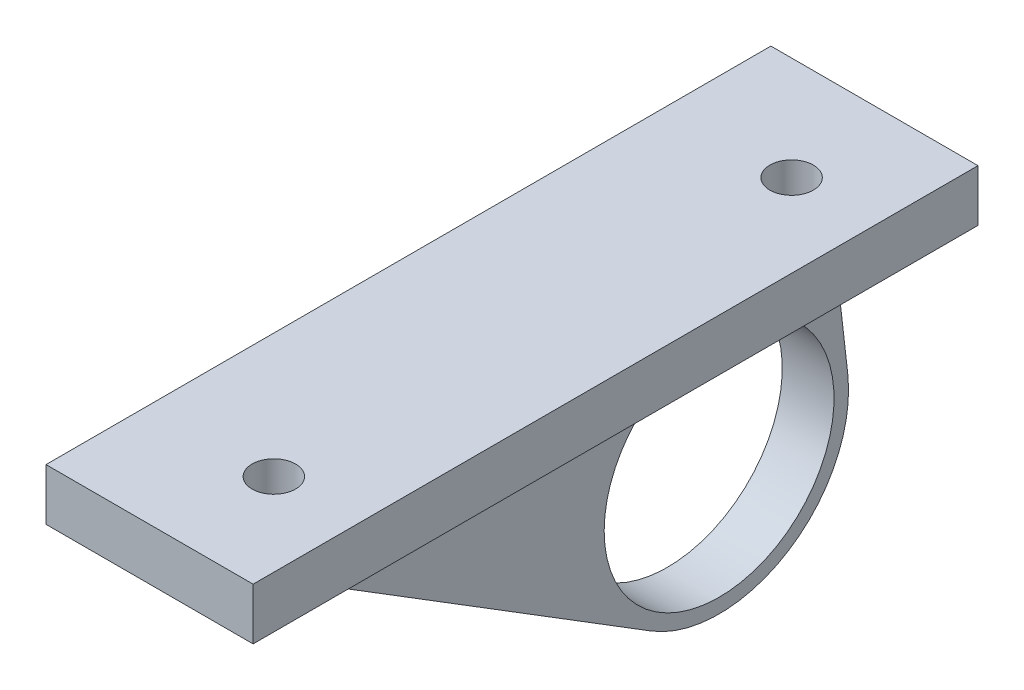
ISO-10303-21;
HEADER;
FILE_DESCRIPTION(('STEP AP214'),'2;1');
FILE_NAME('part.step','',(''),(''),'','','');
FILE_SCHEMA(('AUTOMOTIVE_DESIGN { 1 0 10303 214 1 1 1 1 }'));
ENDSEC;
DATA;
#1=APPLICATION_CONTEXT('core data for automotive mechanical design processes');
#2=APPLICATION_PROTOCOL_DEFINITION('international standard','automotive_design',2000,#1);
#3=PRODUCT_CONTEXT('',#1,'mechanical');
#4=PRODUCT('Part','Part','',(#3));
#5=PRODUCT_RELATED_PRODUCT_CATEGORY('part','',(#4));
#6=PRODUCT_DEFINITION_FORMATION('','',#4);
#7=PRODUCT_DEFINITION_CONTEXT('part definition',#1,'design');
#8=PRODUCT_DEFINITION('design','',#6,#7);
#9=PRODUCT_DEFINITION_SHAPE('','',#8);
#10=(LENGTH_UNIT() NAMED_UNIT(*) SI_UNIT(.MILLI.,.METRE.));
#11=(NAMED_UNIT(*) PLANE_ANGLE_UNIT() SI_UNIT($,.RADIAN.));
#12=(NAMED_UNIT(*) SI_UNIT($,.STERADIAN.) SOLID_ANGLE_UNIT());
#13=UNCERTAINTY_MEASURE_WITH_UNIT(LENGTH_MEASURE(1.E-05),#10,'distance_accuracy_value','');
#14=(GEOMETRIC_REPRESENTATION_CONTEXT(3) GLOBAL_UNCERTAINTY_ASSIGNED_CONTEXT((#13)) GLOBAL_UNIT_ASSIGNED_CONTEXT((#10,
#11,#12)) REPRESENTATION_CONTEXT('',''));
#15=CARTESIAN_POINT('',(0.,0.,0.));
#16=DIRECTION('',(0.,0.,1.));
#17=DIRECTION('',(1.,0.,0.));
#18=AXIS2_PLACEMENT_3D('',#15,#16,#17);
#19=CARTESIAN_POINT('',(0.,0.,0.));
#20=DIRECTION('',(0.,1.,0.));
#21=DIRECTION('',(0.,0.,1.));
#22=AXIS2_PLACEMENT_3D('',#19,#20,#21);
#23=PLANE('',#22);
#24=CARTESIAN_POINT('',(2000.,0.,25000.));
#25=DIRECTION('',(0.,1.,0.));
#26=DIRECTION('',(0.,0.,1.));
#27=AXIS2_PLACEMENT_3D('',#24,#25,#26);
#28=CIRCLE('',#27,2100.);
#29=CARTESIAN_POINT('',(2000.,0.,27100.));
#30=VERTEX_POINT('',#29);
#31=EDGE_CURVE('E142',#30,#30,#28,.T.);
#32=ORIENTED_EDGE('',*,*,#31,.T.);
#33=EDGE_LOOP('',(#32));
#34=FACE_BOUND('',#33,.T.);
#35=CARTESIAN_POINT('',(2000.,0.,-25000.));
#36=DIRECTION('',(0.,1.,0.));
#37=DIRECTION('',(0.,0.,1.));
#38=AXIS2_PLACEMENT_3D('',#35,#36,#37);
#39=CIRCLE('',#38,2100.);
#40=CARTESIAN_POINT('',(2000.,0.,-22900.));
#41=VERTEX_POINT('',#40);
#42=EDGE_CURVE('E147',#41,#41,#39,.T.);
#43=ORIENTED_EDGE('',*,*,#42,.T.);
#44=EDGE_LOOP('',(#43));
#45=FACE_BOUND('',#44,.T.);
#46=DIRECTION('',(0.,0.,1.));
#47=VECTOR('',#46,1.);
#48=CARTESIAN_POINT('',(-5000.,0.,6.69331815983922E-13));
#49=LINE('',#48,#47);
#50=CARTESIAN_POINT('',(-5000.,0.,-35000.));
#51=VERTEX_POINT('',#50);
#52=CARTESIAN_POINT('',(-4999.99999999999,0.,35000.));
#53=VERTEX_POINT('',#52);
#54=EDGE_CURVE('E50',#51,#53,#49,.T.);
#55=ORIENTED_EDGE('',*,*,#54,.F.);
#56=DIRECTION('',(-1.,0.,0.));
#57=VECTOR('',#56,1.);
#58=CARTESIAN_POINT('',(-10000.,0.,-35000.));
#59=LINE('',#58,#57);
#60=CARTESIAN_POINT('',(10000.,0.,-35000.));
#61=VERTEX_POINT('',#60);
#62=EDGE_CURVE('E166',#61,#51,#59,.T.);
#63=ORIENTED_EDGE('',*,*,#62,.F.);
#64=DIRECTION('',(0.,0.,-1.));
#65=VECTOR('',#64,1.);
#66=CARTESIAN_POINT('',(10000.,0.,-35000.));
#67=LINE('',#66,#65);
#68=CARTESIAN_POINT('',(10000.,0.,35000.));
#69=VERTEX_POINT('',#68);
#70=EDGE_CURVE('E153',#69,#61,#67,.T.);
#71=ORIENTED_EDGE('',*,*,#70,.F.);
#72=DIRECTION('',(1.,0.,0.));
#73=VECTOR('',#72,1.);
#74=CARTESIAN_POINT('',(-9999.99999999999,0.,35000.));
#75=LINE('',#74,#73);
#76=EDGE_CURVE('E78',#53,#69,#75,.T.);
#77=ORIENTED_EDGE('',*,*,#76,.F.);
#78=EDGE_LOOP('',(#55,#63,#71,#77));
#79=FACE_BOUND('',#78,.T.);
#80=ADVANCED_FACE('F35',(#34,#45,#79),#23,.F.);
#81=CARTESIAN_POINT('',(0.,5000.,0.));
#82=DIRECTION('',(0.,1.,0.));
#83=DIRECTION('',(0.,0.,1.));
#84=AXIS2_PLACEMENT_3D('',#81,#82,#83);
#85=PLANE('',#84);
#86=DIRECTION('',(0.,0.,1.));
#87=VECTOR('',#86,1.);
#88=CARTESIAN_POINT('',(-10000.,5000.,-35000.));
#89=LINE('',#88,#87);
#90=CARTESIAN_POINT('',(-10000.,5000.,-35000.));
#91=VERTEX_POINT('',#90);
#92=CARTESIAN_POINT('',(-9999.99999999999,5000.,35000.));
#93=VERTEX_POINT('',#92);
#94=EDGE_CURVE('E160',#91,#93,#89,.T.);
#95=ORIENTED_EDGE('',*,*,#94,.T.);
#96=DIRECTION('',(1.,0.,0.));
#97=VECTOR('',#96,1.);
#98=CARTESIAN_POINT('',(-9999.99999999999,5000.,35000.));
#99=LINE('',#98,#97);
#100=CARTESIAN_POINT('',(10000.,5000.,35000.));
#101=VERTEX_POINT('',#100);
#102=EDGE_CURVE('E59',#93,#101,#99,.T.);
#103=ORIENTED_EDGE('',*,*,#102,.T.);
#104=DIRECTION('',(0.,0.,-1.));
#105=VECTOR('',#104,1.);
#106=CARTESIAN_POINT('',(10000.,5000.,-35000.));
#107=LINE('',#106,#105);
#108=CARTESIAN_POINT('',(10000.,5000.,-35000.));
#109=VERTEX_POINT('',#108);
#110=EDGE_CURVE('E83',#101,#109,#107,.T.);
#111=ORIENTED_EDGE('',*,*,#110,.T.);
#112=DIRECTION('',(-1.,0.,0.));
#113=VECTOR('',#112,1.);
#114=CARTESIAN_POINT('',(-10000.,5000.,-35000.));
#115=LINE('',#114,#113);
#116=EDGE_CURVE('E157',#109,#91,#115,.T.);
#117=ORIENTED_EDGE('',*,*,#116,.T.);
#118=EDGE_LOOP('',(#95,#103,#111,#117));
#119=FACE_BOUND('',#118,.T.);
#120=CARTESIAN_POINT('',(2000.,5000.,-25000.));
#121=DIRECTION('',(0.,1.,0.));
#122=DIRECTION('',(0.,0.,1.));
#123=AXIS2_PLACEMENT_3D('',#120,#121,#122);
#124=CIRCLE('',#123,2100.);
#125=CARTESIAN_POINT('',(2000.,5000.,-22900.));
#126=VERTEX_POINT('',#125);
#127=EDGE_CURVE('E150',#126,#126,#124,.T.);
#128=ORIENTED_EDGE('',*,*,#127,.F.);
#129=EDGE_LOOP('',(#128));
#130=FACE_BOUND('',#129,.T.);
#131=CARTESIAN_POINT('',(2000.,5000.,25000.));
#132=DIRECTION('',(0.,1.,0.));
#133=DIRECTION('',(0.,0.,1.));
#134=AXIS2_PLACEMENT_3D('',#131,#132,#133);
#135=CIRCLE('',#134,2100.);
#136=CARTESIAN_POINT('',(2000.,5000.,27100.));
#137=VERTEX_POINT('',#136);
#138=EDGE_CURVE('E144',#137,#137,#135,.T.);
#139=ORIENTED_EDGE('',*,*,#138,.F.);
#140=EDGE_LOOP('',(#139));
#141=FACE_BOUND('',#140,.T.);
#142=ADVANCED_FACE('F200',(#119,#130,#141),#85,.T.);
#143=CARTESIAN_POINT('',(10000.,5000.,-35000.));
#144=DIRECTION('',(-1.,0.,0.));
#145=DIRECTION('',(0.,0.,1.));
#146=AXIS2_PLACEMENT_3D('',#143,#144,#145);
#147=PLANE('',#146);
#148=ORIENTED_EDGE('',*,*,#70,.T.);
#149=DIRECTION('',(0.,-1.,0.));
#150=VECTOR('',#149,1.);
#151=CARTESIAN_POINT('',(10000.,5000.,-35000.));
#152=LINE('',#151,#150);
#153=EDGE_CURVE('E11',#109,#61,#152,.T.);
#154=ORIENTED_EDGE('',*,*,#153,.F.);
#155=ORIENTED_EDGE('',*,*,#110,.F.);
#156=DIRECTION('',(0.,-1.,0.));
#157=VECTOR('',#156,1.);
#158=CARTESIAN_POINT('',(10000.,5000.,35000.));
#159=LINE('',#158,#157);
#160=EDGE_CURVE('E163',#101,#69,#159,.T.);
#161=ORIENTED_EDGE('',*,*,#160,.T.);
#162=EDGE_LOOP('',(#148,#154,#155,#161));
#163=FACE_BOUND('',#162,.T.);
#164=ADVANCED_FACE('F37',(#163),#147,.F.);
#165=CARTESIAN_POINT('',(-10000.,5000.,-35000.));
#166=DIRECTION('',(0.,0.,1.));
#167=DIRECTION('',(1.,0.,0.));
#168=AXIS2_PLACEMENT_3D('',#165,#166,#167);
#169=PLANE('',#168);
#170=ORIENTED_EDGE('',*,*,#62,.T.);
#171=DIRECTION('',(-1.,0.,0.));
#172=VECTOR('',#171,1.);
#173=CARTESIAN_POINT('',(-5000.,0.,-35000.));
#174=LINE('',#173,#172);
#175=CARTESIAN_POINT('',(-10000.,0.,-35000.));
#176=VERTEX_POINT('',#175);
#177=EDGE_CURVE('E125',#51,#176,#174,.T.);
#178=ORIENTED_EDGE('',*,*,#177,.T.);
#179=DIRECTION('',(0.,-1.,0.));
#180=VECTOR('',#179,1.);
#181=CARTESIAN_POINT('',(-10000.,5000.,-35000.));
#182=LINE('',#181,#180);
#183=EDGE_CURVE('E43',#91,#176,#182,.T.);
#184=ORIENTED_EDGE('',*,*,#183,.F.);
#185=ORIENTED_EDGE('',*,*,#116,.F.);
#186=ORIENTED_EDGE('',*,*,#153,.T.);
#187=EDGE_LOOP('',(#170,#178,#184,#185,#186));
#188=FACE_BOUND('',#187,.T.);
#189=ADVANCED_FACE('F179',(#188),#169,.F.);
#190=CARTESIAN_POINT('',(-10000.,5000.,-35000.));
#191=DIRECTION('',(1.,0.,0.));
#192=DIRECTION('',(0.,0.,-1.));
#193=AXIS2_PLACEMENT_3D('',#190,#191,#192);
#194=PLANE('',#193);
#195=ORIENTED_EDGE('',*,*,#183,.T.);
#196=DIRECTION('',(0.,-0.993479715135537,-0.114009015495317));
#197=VECTOR('',#196,1.);
#198=CARTESIAN_POINT('',(-10000.,3964.29754830097,-34545.0680535026));
#199=LINE('',#198,#197);
#200=CARTESIAN_POINT('',(-10000.,-21074.8873063085,-37418.4964391942));
#201=VERTEX_POINT('',#200);
#202=EDGE_CURVE('E136',#176,#201,#199,.T.);
#203=ORIENTED_EDGE('',*,*,#202,.T.);
#204=CARTESIAN_POINT('',(-10000.,-22500.,-25000.));
#205=DIRECTION('',(-1.,0.,0.));
#206=DIRECTION('',(0.,0.,1.));
#207=AXIS2_PLACEMENT_3D('',#204,#205,#206);
#208=CIRCLE('',#207,12500.);
#209=CARTESIAN_POINT('',(-10000.,-33123.1096712114,-18412.167206629));
#210=VERTEX_POINT('',#209);
#211=EDGE_CURVE('E106',#201,#210,#208,.T.);
#212=ORIENTED_EDGE('',*,*,#211,.T.);
#213=DIRECTION('',(0.,-0.527026623469677,-0.849848773696916));
#214=VECTOR('',#213,1.);
#215=CARTESIAN_POINT('',(-10000.,-15676.2525381466,9721.49716460469));
#216=LINE('',#215,#214);
#217=CARTESIAN_POINT('',(-9999.99999999999,0.,35000.));
#218=VERTEX_POINT('',#217);
#219=EDGE_CURVE('E129',#218,#210,#216,.T.);
#220=ORIENTED_EDGE('',*,*,#219,.F.);
#221=DIRECTION('',(0.,-1.,0.));
#222=VECTOR('',#221,1.);
#223=CARTESIAN_POINT('',(-9999.99999999999,5000.,35000.));
#224=LINE('',#223,#222);
#225=EDGE_CURVE('E170',#93,#218,#224,.T.);
#226=ORIENTED_EDGE('',*,*,#225,.F.);
#227=ORIENTED_EDGE('',*,*,#94,.F.);
#228=EDGE_LOOP('',(#195,#203,#212,#220,#226,#227));
#229=FACE_BOUND('',#228,.T.);
#230=CARTESIAN_POINT('',(-10000.,-22500.,-25000.));
#231=DIRECTION('',(-1.,0.,0.));
#232=DIRECTION('',(0.,0.,1.));
#233=AXIS2_PLACEMENT_3D('',#230,#231,#232);
#234=CIRCLE('',#233,11100.);
#235=CARTESIAN_POINT('',(-10000.,-22500.,-13900.));
#236=VERTEX_POINT('',#235);
#237=EDGE_CURVE('E126',#236,#236,#234,.T.);
#238=ORIENTED_EDGE('',*,*,#237,.F.);
#239=EDGE_LOOP('',(#238));
#240=FACE_BOUND('',#239,.T.);
#241=ADVANCED_FACE('F175',(#229,#240),#194,.F.);
#242=CARTESIAN_POINT('',(-9999.99999999999,5000.,35000.));
#243=DIRECTION('',(0.,0.,-1.));
#244=DIRECTION('',(-1.,0.,0.));
#245=AXIS2_PLACEMENT_3D('',#242,#243,#244);
#246=PLANE('',#245);
#247=EDGE_CURVE('E158',#218,#53,#75,.T.);
#248=ORIENTED_EDGE('',*,*,#247,.T.);
#249=ORIENTED_EDGE('',*,*,#76,.T.);
#250=ORIENTED_EDGE('',*,*,#160,.F.);
#251=ORIENTED_EDGE('',*,*,#102,.F.);
#252=ORIENTED_EDGE('',*,*,#225,.T.);
#253=EDGE_LOOP('',(#248,#249,#250,#251,#252));
#254=FACE_BOUND('',#253,.T.);
#255=ADVANCED_FACE('F183',(#254),#246,.F.);
#256=CARTESIAN_POINT('',(2000.,5000.,-25000.));
#257=DIRECTION('',(0.,-1.,0.));
#258=DIRECTION('',(0.,0.,-1.));
#259=AXIS2_PLACEMENT_3D('',#256,#257,#258);
#260=CYLINDRICAL_SURFACE('',#259,2100.);
#261=ORIENTED_EDGE('',*,*,#127,.T.);
#262=EDGE_LOOP('',(#261));
#263=FACE_BOUND('',#262,.T.);
#264=ORIENTED_EDGE('',*,*,#42,.F.);
#265=EDGE_LOOP('',(#264));
#266=FACE_BOUND('',#265,.T.);
#267=ADVANCED_FACE('F212',(#263,#266),#260,.F.);
#268=CARTESIAN_POINT('',(2000.,5000.,25000.));
#269=DIRECTION('',(0.,-1.,0.));
#270=DIRECTION('',(0.,0.,-1.));
#271=AXIS2_PLACEMENT_3D('',#268,#269,#270);
#272=CYLINDRICAL_SURFACE('',#271,2100.);
#273=ORIENTED_EDGE('',*,*,#138,.T.);
#274=EDGE_LOOP('',(#273));
#275=FACE_BOUND('',#274,.T.);
#276=ORIENTED_EDGE('',*,*,#31,.F.);
#277=EDGE_LOOP('',(#276));
#278=FACE_BOUND('',#277,.T.);
#279=ADVANCED_FACE('F196',(#275,#278),#272,.F.);
#280=CARTESIAN_POINT('',(-5000.,3964.29754830097,-34545.0680535026));
#281=DIRECTION('',(0.,0.114009015495317,-0.993479715135537));
#282=DIRECTION('',(0.,0.993479715135537,0.114009015495317));
#283=AXIS2_PLACEMENT_3D('',#280,#281,#282);
#284=PLANE('',#283);
#285=ORIENTED_EDGE('',*,*,#202,.F.);
#286=ORIENTED_EDGE('',*,*,#177,.F.);
#287=DIRECTION('',(0.,-0.993479715135537,-0.114009015495317));
#288=VECTOR('',#287,1.);
#289=CARTESIAN_POINT('',(-5000.,3964.29754830097,-34545.0680535026));
#290=LINE('',#289,#288);
#291=CARTESIAN_POINT('',(-5000.,-21074.8873063085,-37418.4964391942));
#292=VERTEX_POINT('',#291);
#293=EDGE_CURVE('E118',#51,#292,#290,.T.);
#294=ORIENTED_EDGE('',*,*,#293,.T.);
#295=DIRECTION('',(-1.,0.,0.));
#296=VECTOR('',#295,1.);
#297=CARTESIAN_POINT('',(-5000.,-21074.8873063085,-37418.4964391942));
#298=LINE('',#297,#296);
#299=EDGE_CURVE('E101',#292,#201,#298,.T.);
#300=ORIENTED_EDGE('',*,*,#299,.T.);
#301=EDGE_LOOP('',(#285,#286,#294,#300));
#302=FACE_BOUND('',#301,.T.);
#303=ADVANCED_FACE('F124',(#302),#284,.T.);
#304=CARTESIAN_POINT('',(-5000.,-15676.2525381466,9721.49716460469));
#305=DIRECTION('',(0.,0.849848773696916,-0.527026623469677));
#306=DIRECTION('',(0.,0.527026623469677,0.849848773696916));
#307=AXIS2_PLACEMENT_3D('',#304,#305,#306);
#308=PLANE('',#307);
#309=ORIENTED_EDGE('',*,*,#219,.T.);
#310=DIRECTION('',(-1.,0.,0.));
#311=VECTOR('',#310,1.);
#312=CARTESIAN_POINT('',(-5000.,-33123.1096712114,-18412.167206629));
#313=LINE('',#312,#311);
#314=CARTESIAN_POINT('',(-5000.,-33123.1096712114,-18412.167206629));
#315=VERTEX_POINT('',#314);
#316=EDGE_CURVE('E111',#315,#210,#313,.T.);
#317=ORIENTED_EDGE('',*,*,#316,.F.);
#318=DIRECTION('',(0.,-0.527026623469677,-0.849848773696916));
#319=VECTOR('',#318,1.);
#320=CARTESIAN_POINT('',(-5000.,-15676.2525381466,9721.49716460469));
#321=LINE('',#320,#319);
#322=EDGE_CURVE('E120',#53,#315,#321,.T.);
#323=ORIENTED_EDGE('',*,*,#322,.F.);
#324=ORIENTED_EDGE('',*,*,#247,.F.);
#325=EDGE_LOOP('',(#309,#317,#323,#324));
#326=FACE_BOUND('',#325,.T.);
#327=ADVANCED_FACE('F187',(#326),#308,.F.);
#328=CARTESIAN_POINT('',(-5000.,-22500.,-25000.));
#329=DIRECTION('',(-1.,0.,0.));
#330=DIRECTION('',(0.,0.,1.));
#331=AXIS2_PLACEMENT_3D('',#328,#329,#330);
#332=CYLINDRICAL_SURFACE('',#331,12500.);
#333=ORIENTED_EDGE('',*,*,#211,.F.);
#334=ORIENTED_EDGE('',*,*,#299,.F.);
#335=CARTESIAN_POINT('',(-5000.,-22500.,-25000.));
#336=DIRECTION('',(-1.,0.,0.));
#337=DIRECTION('',(0.,0.,1.));
#338=AXIS2_PLACEMENT_3D('',#335,#336,#337);
#339=CIRCLE('',#338,12500.);
#340=EDGE_CURVE('E104',#292,#315,#339,.T.);
#341=ORIENTED_EDGE('',*,*,#340,.T.);
#342=ORIENTED_EDGE('',*,*,#316,.T.);
#343=EDGE_LOOP('',(#333,#334,#341,#342));
#344=FACE_BOUND('',#343,.T.);
#345=ADVANCED_FACE('F103',(#344),#332,.T.);
#346=CARTESIAN_POINT('',(-5000.,-22500.,-25000.));
#347=DIRECTION('',(-1.,0.,0.));
#348=DIRECTION('',(0.,0.,1.));
#349=AXIS2_PLACEMENT_3D('',#346,#347,#348);
#350=CYLINDRICAL_SURFACE('',#349,11100.);
#351=CARTESIAN_POINT('',(-5000.,-22500.,-25000.));
#352=DIRECTION('',(-1.,0.,0.));
#353=DIRECTION('',(0.,0.,1.));
#354=AXIS2_PLACEMENT_3D('',#351,#352,#353);
#355=CIRCLE('',#354,11100.);
#356=CARTESIAN_POINT('',(-5000.,-22500.,-13900.));
#357=VERTEX_POINT('',#356);
#358=EDGE_CURVE('E112',#357,#357,#355,.T.);
#359=ORIENTED_EDGE('',*,*,#358,.F.);
#360=EDGE_LOOP('',(#359));
#361=FACE_BOUND('',#360,.T.);
#362=ORIENTED_EDGE('',*,*,#237,.T.);
#363=EDGE_LOOP('',(#362));
#364=FACE_BOUND('',#363,.T.);
#365=ADVANCED_FACE('F194',(#361,#364),#350,.F.);
#366=CARTESIAN_POINT('',(-5000.,0.,6.69331815983922E-13));
#367=DIRECTION('',(-1.,0.,0.));
#368=DIRECTION('',(0.,0.,1.));
#369=AXIS2_PLACEMENT_3D('',#366,#367,#368);
#370=PLANE('',#369);
#371=ORIENTED_EDGE('',*,*,#293,.F.);
#372=ORIENTED_EDGE('',*,*,#54,.T.);
#373=ORIENTED_EDGE('',*,*,#322,.T.);
#374=ORIENTED_EDGE('',*,*,#340,.F.);
#375=EDGE_LOOP('',(#371,#372,#373,#374));
#376=FACE_BOUND('',#375,.T.);
#377=ORIENTED_EDGE('',*,*,#358,.T.);
#378=EDGE_LOOP('',(#377));
#379=FACE_BOUND('',#378,.T.);
#380=ADVANCED_FACE('F116',(#376,#379),#370,.F.);
#381=CLOSED_SHELL('',(#80,#142,#164,#189,#241,#255,#267,#279,#303,#327,#345,#365,#380));
#382=MANIFOLD_SOLID_BREP('B2',#381);
#383=ADVANCED_BREP_SHAPE_REPRESENTATION('',(#18,#382),#14);
#384=SHAPE_DEFINITION_REPRESENTATION(#9,#383);
ENDSEC;
END-ISO-10303-21;
